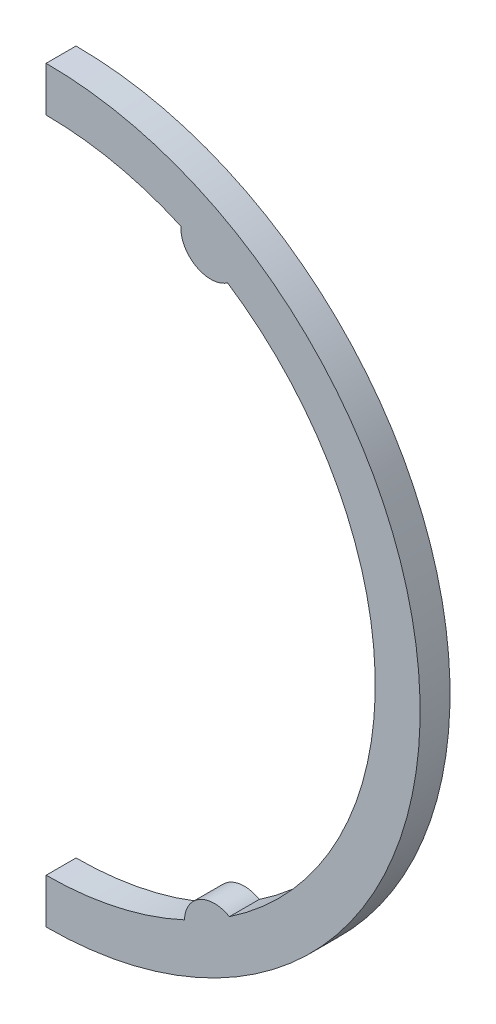
ISO-10303-21;
HEADER;
FILE_DESCRIPTION(('STEP AP214'),'2;1');
FILE_NAME('part.step','',(''),(''),'','','');
FILE_SCHEMA(('AUTOMOTIVE_DESIGN { 1 0 10303 214 1 1 1 1 }'));
ENDSEC;
DATA;
#1=APPLICATION_CONTEXT('core data for automotive mechanical design processes');
#2=APPLICATION_PROTOCOL_DEFINITION('international standard','automotive_design',2000,#1);
#3=PRODUCT_CONTEXT('',#1,'mechanical');
#4=PRODUCT('Part','Part','',(#3));
#5=PRODUCT_RELATED_PRODUCT_CATEGORY('part','',(#4));
#6=PRODUCT_DEFINITION_FORMATION('','',#4);
#7=PRODUCT_DEFINITION_CONTEXT('part definition',#1,'design');
#8=PRODUCT_DEFINITION('design','',#6,#7);
#9=PRODUCT_DEFINITION_SHAPE('','',#8);
#10=(LENGTH_UNIT() NAMED_UNIT(*) SI_UNIT(.MILLI.,.METRE.));
#11=(NAMED_UNIT(*) PLANE_ANGLE_UNIT() SI_UNIT($,.RADIAN.));
#12=(NAMED_UNIT(*) SI_UNIT($,.STERADIAN.) SOLID_ANGLE_UNIT());
#13=UNCERTAINTY_MEASURE_WITH_UNIT(LENGTH_MEASURE(1.E-05),#10,'distance_accuracy_value','');
#14=(GEOMETRIC_REPRESENTATION_CONTEXT(3) GLOBAL_UNCERTAINTY_ASSIGNED_CONTEXT((#13)) GLOBAL_UNIT_ASSIGNED_CONTEXT((#10,
#11,#12)) REPRESENTATION_CONTEXT('',''));
#15=CARTESIAN_POINT('',(0.,0.,0.));
#16=DIRECTION('',(0.,0.,1.));
#17=DIRECTION('',(1.,0.,0.));
#18=AXIS2_PLACEMENT_3D('',#15,#16,#17);
#19=CARTESIAN_POINT('',(50.,-50.3853716973348,4.));
#20=DIRECTION('',(0.,0.,-1.));
#21=DIRECTION('',(-1.,0.,0.));
#22=AXIS2_PLACEMENT_3D('',#19,#20,#21);
#23=CYLINDRICAL_SURFACE('',#22,50.);
#24=CARTESIAN_POINT('',(50.,-50.3853716973348,0.));
#25=DIRECTION('',(0.,0.,1.));
#26=DIRECTION('',(-1.,0.,0.));
#27=AXIS2_PLACEMENT_3D('',#24,#25,#26);
#28=CIRCLE('',#27,50.);
#29=CARTESIAN_POINT('',(50.,-100.385371697335,0.));
#30=VERTEX_POINT('',#29);
#31=CARTESIAN_POINT('',(50.,-0.385371697334762,0.));
#32=VERTEX_POINT('',#31);
#33=EDGE_CURVE('E129',#30,#32,#28,.T.);
#34=ORIENTED_EDGE('',*,*,#33,.T.);
#35=DIRECTION('',(0.,0.,-1.));
#36=VECTOR('',#35,1.);
#37=CARTESIAN_POINT('',(50.,-0.385371697334762,4.));
#38=LINE('',#37,#36);
#39=CARTESIAN_POINT('',(50.,-0.385371697334762,4.));
#40=VERTEX_POINT('',#39);
#41=EDGE_CURVE('E11',#40,#32,#38,.T.);
#42=ORIENTED_EDGE('',*,*,#41,.F.);
#43=CARTESIAN_POINT('',(50.,-50.3853716973348,4.));
#44=DIRECTION('',(0.,0.,1.));
#45=DIRECTION('',(-1.,0.,0.));
#46=AXIS2_PLACEMENT_3D('',#43,#44,#45);
#47=CIRCLE('',#46,50.);
#48=CARTESIAN_POINT('',(50.,-100.385371697335,4.));
#49=VERTEX_POINT('',#48);
#50=EDGE_CURVE('E143',#49,#40,#47,.T.);
#51=ORIENTED_EDGE('',*,*,#50,.F.);
#52=DIRECTION('',(0.,0.,-1.));
#53=VECTOR('',#52,1.);
#54=CARTESIAN_POINT('',(50.,-100.385371697335,4.));
#55=LINE('',#54,#53);
#56=EDGE_CURVE('E125',#49,#30,#55,.T.);
#57=ORIENTED_EDGE('',*,*,#56,.T.);
#58=EDGE_LOOP('',(#34,#42,#51,#57));
#59=FACE_BOUND('',#58,.T.);
#60=ADVANCED_FACE('F33',(#59),#23,.T.);
#61=CARTESIAN_POINT('',(50.,-6.38537169733476,4.));
#62=DIRECTION('',(1.,0.,0.));
#63=DIRECTION('',(0.,0.,-1.));
#64=AXIS2_PLACEMENT_3D('',#61,#62,#63);
#65=PLANE('',#64);
#66=DIRECTION('',(0.,-1.,0.));
#67=VECTOR('',#66,1.);
#68=CARTESIAN_POINT('',(50.,-6.38537169733476,0.));
#69=LINE('',#68,#67);
#70=CARTESIAN_POINT('',(50.,-6.38537169733476,0.));
#71=VERTEX_POINT('',#70);
#72=EDGE_CURVE('E132',#32,#71,#69,.T.);
#73=ORIENTED_EDGE('',*,*,#72,.T.);
#74=DIRECTION('',(0.,0.,-1.));
#75=VECTOR('',#74,1.);
#76=CARTESIAN_POINT('',(50.,-6.38537169733476,4.));
#77=LINE('',#76,#75);
#78=CARTESIAN_POINT('',(50.,-6.38537169733476,4.));
#79=VERTEX_POINT('',#78);
#80=EDGE_CURVE('E41',#79,#71,#77,.T.);
#81=ORIENTED_EDGE('',*,*,#80,.F.);
#82=DIRECTION('',(0.,-1.,0.));
#83=VECTOR('',#82,1.);
#84=CARTESIAN_POINT('',(50.,-6.38537169733476,4.));
#85=LINE('',#84,#83);
#86=EDGE_CURVE('E92',#40,#79,#85,.T.);
#87=ORIENTED_EDGE('',*,*,#86,.F.);
#88=ORIENTED_EDGE('',*,*,#41,.T.);
#89=EDGE_LOOP('',(#73,#81,#87,#88));
#90=FACE_BOUND('',#89,.T.);
#91=ADVANCED_FACE('F178',(#90),#65,.F.);
#92=CARTESIAN_POINT('',(50.,-50.3853716973348,4.));
#93=DIRECTION('',(0.,0.,-1.));
#94=DIRECTION('',(-1.,0.,0.));
#95=AXIS2_PLACEMENT_3D('',#92,#93,#94);
#96=CYLINDRICAL_SURFACE('',#95,44.);
#97=CARTESIAN_POINT('',(50.,-50.3853716973348,0.));
#98=DIRECTION('',(0.,0.,-1.));
#99=DIRECTION('',(-1.,0.,0.));
#100=AXIS2_PLACEMENT_3D('',#97,#98,#99);
#101=CIRCLE('',#100,44.);
#102=CARTESIAN_POINT('',(68.0027568768502,-10.2368879796024,0.));
#103=VERTEX_POINT('',#102);
#104=EDGE_CURVE('E134',#71,#103,#101,.T.);
#105=ORIENTED_EDGE('',*,*,#104,.T.);
#106=DIRECTION('',(0.,0.,-1.));
#107=VECTOR('',#106,1.);
#108=CARTESIAN_POINT('',(68.0027568768502,-10.2368879796024,4.));
#109=LINE('',#108,#107);
#110=CARTESIAN_POINT('',(68.0027568768502,-10.2368879796024,4.));
#111=VERTEX_POINT('',#110);
#112=EDGE_CURVE('E150',#111,#103,#109,.T.);
#113=ORIENTED_EDGE('',*,*,#112,.F.);
#114=CARTESIAN_POINT('',(50.,-50.3853716973348,4.));
#115=DIRECTION('',(0.,0.,-1.));
#116=DIRECTION('',(-1.,0.,0.));
#117=AXIS2_PLACEMENT_3D('',#114,#115,#116);
#118=CIRCLE('',#117,44.);
#119=EDGE_CURVE('E158',#79,#111,#118,.T.);
#120=ORIENTED_EDGE('',*,*,#119,.F.);
#121=ORIENTED_EDGE('',*,*,#80,.T.);
#122=EDGE_LOOP('',(#105,#113,#120,#121));
#123=FACE_BOUND('',#122,.T.);
#124=ADVANCED_FACE('F156',(#123),#96,.F.);
#125=CARTESIAN_POINT('',(72.,-10.3853716973348,4.));
#126=DIRECTION('',(0.,0.,-1.));
#127=DIRECTION('',(-1.,0.,0.));
#128=AXIS2_PLACEMENT_3D('',#125,#126,#127);
#129=CYLINDRICAL_SURFACE('',#128,4.00000000000001);
#130=CARTESIAN_POINT('',(72.,-10.3853716973348,0.));
#131=DIRECTION('',(0.,0.,1.));
#132=DIRECTION('',(1.,0.,0.));
#133=AXIS2_PLACEMENT_3D('',#130,#131,#132);
#134=CIRCLE('',#133,4.00000000000001);
#135=CARTESIAN_POINT('',(74.2659571346662,-13.6816481214011,0.));
#136=VERTEX_POINT('',#135);
#137=EDGE_CURVE('E136',#103,#136,#134,.T.);
#138=ORIENTED_EDGE('',*,*,#137,.T.);
#139=DIRECTION('',(0.,0.,-1.));
#140=VECTOR('',#139,1.);
#141=CARTESIAN_POINT('',(74.2659571346662,-13.6816481214011,4.));
#142=LINE('',#141,#140);
#143=CARTESIAN_POINT('',(74.2659571346662,-13.6816481214011,4.));
#144=VERTEX_POINT('',#143);
#145=EDGE_CURVE('E147',#144,#136,#142,.T.);
#146=ORIENTED_EDGE('',*,*,#145,.F.);
#147=CARTESIAN_POINT('',(72.,-10.3853716973348,4.));
#148=DIRECTION('',(0.,0.,1.));
#149=DIRECTION('',(1.,0.,0.));
#150=AXIS2_PLACEMENT_3D('',#147,#148,#149);
#151=CIRCLE('',#150,4.00000000000001);
#152=EDGE_CURVE('E170',#111,#144,#151,.T.);
#153=ORIENTED_EDGE('',*,*,#152,.F.);
#154=ORIENTED_EDGE('',*,*,#112,.T.);
#155=EDGE_LOOP('',(#138,#146,#153,#154));
#156=FACE_BOUND('',#155,.T.);
#157=ADVANCED_FACE('F166',(#156),#129,.T.);
#158=CARTESIAN_POINT('',(50.,-50.3853716973348,4.));
#159=DIRECTION('',(0.,0.,-1.));
#160=DIRECTION('',(-1.,0.,0.));
#161=AXIS2_PLACEMENT_3D('',#158,#159,#160);
#162=CYLINDRICAL_SURFACE('',#161,44.);
#163=CARTESIAN_POINT('',(50.,-50.3853716973348,0.));
#164=DIRECTION('',(0.,0.,-1.));
#165=DIRECTION('',(-1.,0.,0.));
#166=AXIS2_PLACEMENT_3D('',#163,#164,#165);
#167=CIRCLE('',#166,44.);
#168=CARTESIAN_POINT('',(74.5005709406704,-86.9329027162857,0.));
#169=VERTEX_POINT('',#168);
#170=EDGE_CURVE('E138',#136,#169,#167,.T.);
#171=ORIENTED_EDGE('',*,*,#170,.T.);
#172=DIRECTION('',(0.,0.,-1.));
#173=VECTOR('',#172,1.);
#174=CARTESIAN_POINT('',(74.5005709406704,-86.9329027162857,4.));
#175=LINE('',#174,#173);
#176=CARTESIAN_POINT('',(74.5005709406704,-86.9329027162857,4.));
#177=VERTEX_POINT('',#176);
#178=EDGE_CURVE('E120',#177,#169,#175,.T.);
#179=ORIENTED_EDGE('',*,*,#178,.F.);
#180=CARTESIAN_POINT('',(50.,-50.3853716973348,4.));
#181=DIRECTION('',(0.,0.,-1.));
#182=DIRECTION('',(-1.,0.,0.));
#183=AXIS2_PLACEMENT_3D('',#180,#181,#182);
#184=CIRCLE('',#183,44.);
#185=EDGE_CURVE('E111',#144,#177,#184,.T.);
#186=ORIENTED_EDGE('',*,*,#185,.F.);
#187=ORIENTED_EDGE('',*,*,#145,.T.);
#188=EDGE_LOOP('',(#171,#179,#186,#187));
#189=FACE_BOUND('',#188,.T.);
#190=ADVANCED_FACE('F169',(#189),#162,.F.);
#191=CARTESIAN_POINT('',(72.4998738692551,-90.3966017835302,4.));
#192=DIRECTION('',(0.,0.,-1.));
#193=DIRECTION('',(-1.,0.,0.));
#194=AXIS2_PLACEMENT_3D('',#191,#192,#193);
#195=CYLINDRICAL_SURFACE('',#194,4.);
#196=CARTESIAN_POINT('',(72.4998738692551,-90.3966017835302,0.));
#197=DIRECTION('',(0.,0.,1.));
#198=DIRECTION('',(-1.,0.,0.));
#199=AXIS2_PLACEMENT_3D('',#196,#197,#198);
#200=CIRCLE('',#199,4.);
#201=CARTESIAN_POINT('',(68.5008829152145,-90.3067610939668,0.));
#202=VERTEX_POINT('',#201);
#203=EDGE_CURVE('E119',#169,#202,#200,.T.);
#204=ORIENTED_EDGE('',*,*,#203,.T.);
#205=DIRECTION('',(0.,0.,-1.));
#206=VECTOR('',#205,1.);
#207=CARTESIAN_POINT('',(68.5008829152145,-90.3067610939668,4.));
#208=LINE('',#207,#206);
#209=CARTESIAN_POINT('',(68.5008829152145,-90.3067610939668,4.));
#210=VERTEX_POINT('',#209);
#211=EDGE_CURVE('E116',#210,#202,#208,.T.);
#212=ORIENTED_EDGE('',*,*,#211,.F.);
#213=CARTESIAN_POINT('',(72.4998738692551,-90.3966017835302,4.));
#214=DIRECTION('',(0.,0.,1.));
#215=DIRECTION('',(-1.,0.,0.));
#216=AXIS2_PLACEMENT_3D('',#213,#214,#215);
#217=CIRCLE('',#216,4.);
#218=EDGE_CURVE('E105',#177,#210,#217,.T.);
#219=ORIENTED_EDGE('',*,*,#218,.F.);
#220=ORIENTED_EDGE('',*,*,#178,.T.);
#221=EDGE_LOOP('',(#204,#212,#219,#220));
#222=FACE_BOUND('',#221,.T.);
#223=ADVANCED_FACE('F117',(#222),#195,.T.);
#224=CARTESIAN_POINT('',(50.,-50.3853716973348,4.));
#225=DIRECTION('',(0.,0.,-1.));
#226=DIRECTION('',(-1.,0.,0.));
#227=AXIS2_PLACEMENT_3D('',#224,#225,#226);
#228=CYLINDRICAL_SURFACE('',#227,44.);
#229=CARTESIAN_POINT('',(50.,-50.3853716973348,0.));
#230=DIRECTION('',(0.,0.,-1.));
#231=DIRECTION('',(-1.,0.,0.));
#232=AXIS2_PLACEMENT_3D('',#229,#230,#231);
#233=CIRCLE('',#232,44.);
#234=CARTESIAN_POINT('',(50.,-94.3853716973348,0.));
#235=VERTEX_POINT('',#234);
#236=EDGE_CURVE('E78',#202,#235,#233,.T.);
#237=ORIENTED_EDGE('',*,*,#236,.T.);
#238=DIRECTION('',(0.,0.,-1.));
#239=VECTOR('',#238,1.);
#240=CARTESIAN_POINT('',(50.,-94.3853716973348,4.));
#241=LINE('',#240,#239);
#242=CARTESIAN_POINT('',(50.,-94.3853716973348,4.));
#243=VERTEX_POINT('',#242);
#244=EDGE_CURVE('E121',#243,#235,#241,.T.);
#245=ORIENTED_EDGE('',*,*,#244,.F.);
#246=CARTESIAN_POINT('',(50.,-50.3853716973348,4.));
#247=DIRECTION('',(0.,0.,-1.));
#248=DIRECTION('',(-1.,0.,0.));
#249=AXIS2_PLACEMENT_3D('',#246,#247,#248);
#250=CIRCLE('',#249,44.);
#251=EDGE_CURVE('E109',#210,#243,#250,.T.);
#252=ORIENTED_EDGE('',*,*,#251,.F.);
#253=ORIENTED_EDGE('',*,*,#211,.T.);
#254=EDGE_LOOP('',(#237,#245,#252,#253));
#255=FACE_BOUND('',#254,.T.);
#256=ADVANCED_FACE('F123',(#255),#228,.F.);
#257=CARTESIAN_POINT('',(50.,-100.385371697335,4.));
#258=DIRECTION('',(1.,0.,0.));
#259=DIRECTION('',(0.,1.,0.));
#260=AXIS2_PLACEMENT_3D('',#257,#258,#259);
#261=PLANE('',#260);
#262=DIRECTION('',(0.,-1.,0.));
#263=VECTOR('',#262,1.);
#264=CARTESIAN_POINT('',(50.,-100.385371697335,0.));
#265=LINE('',#264,#263);
#266=EDGE_CURVE('E84',#235,#30,#265,.T.);
#267=ORIENTED_EDGE('',*,*,#266,.T.);
#268=ORIENTED_EDGE('',*,*,#56,.F.);
#269=DIRECTION('',(0.,-1.,0.));
#270=VECTOR('',#269,1.);
#271=CARTESIAN_POINT('',(50.,-100.385371697335,4.));
#272=LINE('',#271,#270);
#273=EDGE_CURVE('E49',#243,#49,#272,.T.);
#274=ORIENTED_EDGE('',*,*,#273,.F.);
#275=ORIENTED_EDGE('',*,*,#244,.T.);
#276=EDGE_LOOP('',(#267,#268,#274,#275));
#277=FACE_BOUND('',#276,.T.);
#278=ADVANCED_FACE('F194',(#277),#261,.F.);
#279=CARTESIAN_POINT('',(50.,-50.3853716973348,4.));
#280=DIRECTION('',(0.,0.,-1.));
#281=DIRECTION('',(-1.,0.,0.));
#282=AXIS2_PLACEMENT_3D('',#279,#280,#281);
#283=PLANE('',#282);
#284=ORIENTED_EDGE('',*,*,#50,.T.);
#285=ORIENTED_EDGE('',*,*,#86,.T.);
#286=ORIENTED_EDGE('',*,*,#119,.T.);
#287=ORIENTED_EDGE('',*,*,#152,.T.);
#288=ORIENTED_EDGE('',*,*,#185,.T.);
#289=ORIENTED_EDGE('',*,*,#218,.T.);
#290=ORIENTED_EDGE('',*,*,#251,.T.);
#291=ORIENTED_EDGE('',*,*,#273,.T.);
#292=EDGE_LOOP('',(#284,#285,#286,#287,#288,#289,#290,#291));
#293=FACE_BOUND('',#292,.T.);
#294=ADVANCED_FACE('F107',(#293),#283,.F.);
#295=CARTESIAN_POINT('',(50.,-50.3853716973348,0.));
#296=DIRECTION('',(0.,0.,-1.));
#297=DIRECTION('',(-1.,0.,0.));
#298=AXIS2_PLACEMENT_3D('',#295,#296,#297);
#299=PLANE('',#298);
#300=ORIENTED_EDGE('',*,*,#33,.F.);
#301=ORIENTED_EDGE('',*,*,#266,.F.);
#302=ORIENTED_EDGE('',*,*,#236,.F.);
#303=ORIENTED_EDGE('',*,*,#203,.F.);
#304=ORIENTED_EDGE('',*,*,#170,.F.);
#305=ORIENTED_EDGE('',*,*,#137,.F.);
#306=ORIENTED_EDGE('',*,*,#104,.F.);
#307=ORIENTED_EDGE('',*,*,#72,.F.);
#308=EDGE_LOOP('',(#300,#301,#302,#303,#304,#305,#306,#307));
#309=FACE_BOUND('',#308,.T.);
#310=ADVANCED_FACE('F162',(#309),#299,.T.);
#311=CLOSED_SHELL('',(#60,#91,#124,#157,#190,#223,#256,#278,#294,#310));
#312=MANIFOLD_SOLID_BREP('B2',#311);
#313=ADVANCED_BREP_SHAPE_REPRESENTATION('',(#18,#312),#14);
#314=SHAPE_DEFINITION_REPRESENTATION(#9,#313);
ENDSEC;
END-ISO-10303-21;
